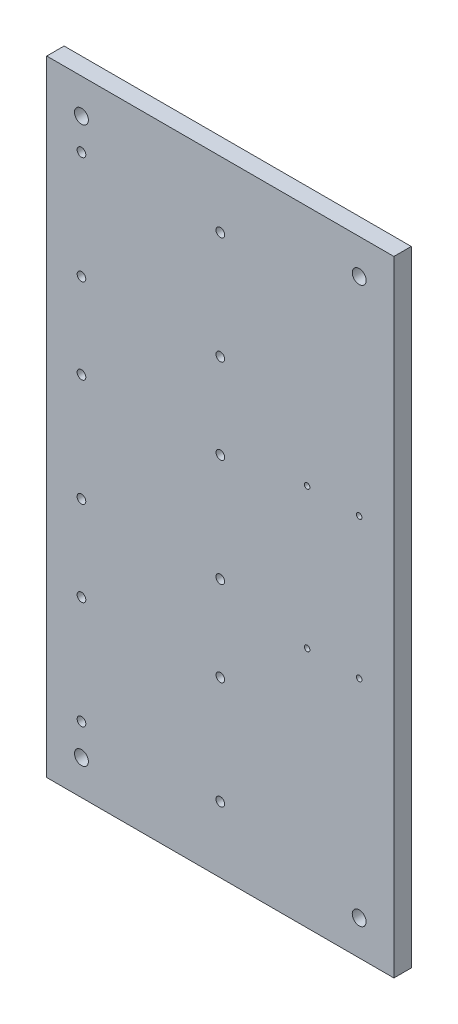
ISO-10303-21;
HEADER;
FILE_DESCRIPTION(('STEP AP214'),'2;1');
FILE_NAME('part.step','',(''),(''),'','','');
FILE_SCHEMA(('AUTOMOTIVE_DESIGN { 1 0 10303 214 1 1 1 1 }'));
ENDSEC;
DATA;
#1=APPLICATION_CONTEXT('core data for automotive mechanical design processes');
#2=APPLICATION_PROTOCOL_DEFINITION('international standard','automotive_design',2000,#1);
#3=PRODUCT_CONTEXT('',#1,'mechanical');
#4=PRODUCT('Part','Part','',(#3));
#5=PRODUCT_RELATED_PRODUCT_CATEGORY('part','',(#4));
#6=PRODUCT_DEFINITION_FORMATION('','',#4);
#7=PRODUCT_DEFINITION_CONTEXT('part definition',#1,'design');
#8=PRODUCT_DEFINITION('design','',#6,#7);
#9=PRODUCT_DEFINITION_SHAPE('','',#8);
#10=(LENGTH_UNIT() NAMED_UNIT(*) SI_UNIT(.MILLI.,.METRE.));
#11=(NAMED_UNIT(*) PLANE_ANGLE_UNIT() SI_UNIT($,.RADIAN.));
#12=(NAMED_UNIT(*) SI_UNIT($,.STERADIAN.) SOLID_ANGLE_UNIT());
#13=UNCERTAINTY_MEASURE_WITH_UNIT(LENGTH_MEASURE(1.E-05),#10,'distance_accuracy_value','');
#14=(GEOMETRIC_REPRESENTATION_CONTEXT(3) GLOBAL_UNCERTAINTY_ASSIGNED_CONTEXT((#13)) GLOBAL_UNIT_ASSIGNED_CONTEXT((#10,
#11,#12)) REPRESENTATION_CONTEXT('',''));
#15=CARTESIAN_POINT('',(0.,0.,0.));
#16=DIRECTION('',(0.,0.,1.));
#17=DIRECTION('',(1.,0.,0.));
#18=AXIS2_PLACEMENT_3D('',#15,#16,#17);
#19=CARTESIAN_POINT('',(0.,0.,5.));
#20=DIRECTION('',(1.,0.,0.));
#21=DIRECTION('',(0.,0.,-1.));
#22=AXIS2_PLACEMENT_3D('',#19,#20,#21);
#23=PLANE('',#22);
#24=DIRECTION('',(0.,-1.,0.));
#25=VECTOR('',#24,1.);
#26=CARTESIAN_POINT('',(0.,0.,0.));
#27=LINE('',#26,#25);
#28=CARTESIAN_POINT('',(0.,180.,0.));
#29=VERTEX_POINT('',#28);
#30=CARTESIAN_POINT('',(0.,0.,0.));
#31=VERTEX_POINT('',#30);
#32=EDGE_CURVE('E95',#29,#31,#27,.T.);
#33=ORIENTED_EDGE('',*,*,#32,.T.);
#34=DIRECTION('',(0.,0.,-1.));
#35=VECTOR('',#34,1.);
#36=CARTESIAN_POINT('',(0.,0.,5.));
#37=LINE('',#36,#35);
#38=CARTESIAN_POINT('',(0.,0.,5.));
#39=VERTEX_POINT('',#38);
#40=EDGE_CURVE('E11',#39,#31,#37,.T.);
#41=ORIENTED_EDGE('',*,*,#40,.F.);
#42=DIRECTION('',(0.,-1.,0.));
#43=VECTOR('',#42,1.);
#44=CARTESIAN_POINT('',(0.,0.,5.));
#45=LINE('',#44,#43);
#46=CARTESIAN_POINT('',(0.,180.,5.));
#47=VERTEX_POINT('',#46);
#48=EDGE_CURVE('E83',#47,#39,#45,.T.);
#49=ORIENTED_EDGE('',*,*,#48,.F.);
#50=DIRECTION('',(0.,0.,-1.));
#51=VECTOR('',#50,1.);
#52=CARTESIAN_POINT('',(0.,180.,5.));
#53=LINE('',#52,#51);
#54=EDGE_CURVE('E91',#47,#29,#53,.T.);
#55=ORIENTED_EDGE('',*,*,#54,.T.);
#56=EDGE_LOOP('',(#33,#41,#49,#55));
#57=FACE_BOUND('',#56,.T.);
#58=ADVANCED_FACE('F32',(#57),#23,.F.);
#59=CARTESIAN_POINT('',(0.,0.,5.));
#60=DIRECTION('',(0.,1.,0.));
#61=DIRECTION('',(0.,0.,1.));
#62=AXIS2_PLACEMENT_3D('',#59,#60,#61);
#63=PLANE('',#62);
#64=DIRECTION('',(1.,0.,0.));
#65=VECTOR('',#64,1.);
#66=CARTESIAN_POINT('',(0.,0.,0.));
#67=LINE('',#66,#65);
#68=CARTESIAN_POINT('',(100.,0.,0.));
#69=VERTEX_POINT('',#68);
#70=EDGE_CURVE('E87',#31,#69,#67,.T.);
#71=ORIENTED_EDGE('',*,*,#70,.T.);
#72=DIRECTION('',(0.,0.,-1.));
#73=VECTOR('',#72,1.);
#74=CARTESIAN_POINT('',(100.,0.,5.));
#75=LINE('',#74,#73);
#76=CARTESIAN_POINT('',(100.,0.,5.));
#77=VERTEX_POINT('',#76);
#78=EDGE_CURVE('E40',#77,#69,#75,.T.);
#79=ORIENTED_EDGE('',*,*,#78,.F.);
#80=DIRECTION('',(1.,0.,0.));
#81=VECTOR('',#80,1.);
#82=CARTESIAN_POINT('',(0.,0.,5.));
#83=LINE('',#82,#81);
#84=EDGE_CURVE('E78',#39,#77,#83,.T.);
#85=ORIENTED_EDGE('',*,*,#84,.F.);
#86=ORIENTED_EDGE('',*,*,#40,.T.);
#87=EDGE_LOOP('',(#71,#79,#85,#86));
#88=FACE_BOUND('',#87,.T.);
#89=ADVANCED_FACE('F86',(#88),#63,.F.);
#90=CARTESIAN_POINT('',(100.,0.,5.));
#91=DIRECTION('',(-1.,0.,0.));
#92=DIRECTION('',(0.,0.,1.));
#93=AXIS2_PLACEMENT_3D('',#90,#91,#92);
#94=PLANE('',#93);
#95=DIRECTION('',(0.,1.,0.));
#96=VECTOR('',#95,1.);
#97=CARTESIAN_POINT('',(100.,0.,0.));
#98=LINE('',#97,#96);
#99=CARTESIAN_POINT('',(100.,180.,0.));
#100=VERTEX_POINT('',#99);
#101=EDGE_CURVE('E65',#69,#100,#98,.T.);
#102=ORIENTED_EDGE('',*,*,#101,.T.);
#103=DIRECTION('',(0.,0.,-1.));
#104=VECTOR('',#103,1.);
#105=CARTESIAN_POINT('',(100.,180.,5.));
#106=LINE('',#105,#104);
#107=CARTESIAN_POINT('',(100.,180.,5.));
#108=VERTEX_POINT('',#107);
#109=EDGE_CURVE('E88',#108,#100,#106,.T.);
#110=ORIENTED_EDGE('',*,*,#109,.F.);
#111=DIRECTION('',(0.,1.,0.));
#112=VECTOR('',#111,1.);
#113=CARTESIAN_POINT('',(100.,0.,5.));
#114=LINE('',#113,#112);
#115=EDGE_CURVE('E81',#77,#108,#114,.T.);
#116=ORIENTED_EDGE('',*,*,#115,.F.);
#117=ORIENTED_EDGE('',*,*,#78,.T.);
#118=EDGE_LOOP('',(#102,#110,#116,#117));
#119=FACE_BOUND('',#118,.T.);
#120=ADVANCED_FACE('F89',(#119),#94,.F.);
#121=CARTESIAN_POINT('',(0.,180.,5.));
#122=DIRECTION('',(0.,-1.,0.));
#123=DIRECTION('',(0.,0.,-1.));
#124=AXIS2_PLACEMENT_3D('',#121,#122,#123);
#125=PLANE('',#124);
#126=DIRECTION('',(-1.,0.,0.));
#127=VECTOR('',#126,1.);
#128=CARTESIAN_POINT('',(0.,180.,0.));
#129=LINE('',#128,#127);
#130=EDGE_CURVE('E71',#100,#29,#129,.T.);
#131=ORIENTED_EDGE('',*,*,#130,.T.);
#132=ORIENTED_EDGE('',*,*,#54,.F.);
#133=DIRECTION('',(-1.,0.,0.));
#134=VECTOR('',#133,1.);
#135=CARTESIAN_POINT('',(0.,180.,5.));
#136=LINE('',#135,#134);
#137=EDGE_CURVE('E48',#108,#47,#136,.T.);
#138=ORIENTED_EDGE('',*,*,#137,.F.);
#139=ORIENTED_EDGE('',*,*,#109,.T.);
#140=EDGE_LOOP('',(#131,#132,#138,#139));
#141=FACE_BOUND('',#140,.T.);
#142=ADVANCED_FACE('F103',(#141),#125,.F.);
#143=CARTESIAN_POINT('',(0.,0.,5.));
#144=DIRECTION('',(0.,0.,-1.));
#145=DIRECTION('',(-1.,0.,0.));
#146=AXIS2_PLACEMENT_3D('',#143,#144,#145);
#147=PLANE('',#146);
#148=CARTESIAN_POINT('',(9.99999999999999,10.,5.));
#149=DIRECTION('',(0.,0.,1.));
#150=DIRECTION('',(1.,0.,0.));
#151=AXIS2_PLACEMENT_3D('',#148,#149,#150);
#152=CIRCLE('',#151,2.);
#153=CARTESIAN_POINT('',(12.,10.,5.));
#154=VERTEX_POINT('',#153);
#155=EDGE_CURVE('E223',#154,#154,#152,.T.);
#156=ORIENTED_EDGE('',*,*,#155,.F.);
#157=EDGE_LOOP('',(#156));
#158=FACE_BOUND('',#157,.T.);
#159=CARTESIAN_POINT('',(9.99999999999999,170.,5.));
#160=DIRECTION('',(0.,0.,1.));
#161=DIRECTION('',(-1.,0.,0.));
#162=AXIS2_PLACEMENT_3D('',#159,#160,#161);
#163=CIRCLE('',#162,2.);
#164=CARTESIAN_POINT('',(8.,170.,5.));
#165=VERTEX_POINT('',#164);
#166=EDGE_CURVE('E217',#165,#165,#163,.T.);
#167=ORIENTED_EDGE('',*,*,#166,.F.);
#168=EDGE_LOOP('',(#167));
#169=FACE_BOUND('',#168,.T.);
#170=CARTESIAN_POINT('',(90.,10.,5.));
#171=DIRECTION('',(0.,0.,1.));
#172=DIRECTION('',(-1.,0.,0.));
#173=AXIS2_PLACEMENT_3D('',#170,#171,#172);
#174=CIRCLE('',#173,2.);
#175=CARTESIAN_POINT('',(88.,10.,5.));
#176=VERTEX_POINT('',#175);
#177=EDGE_CURVE('E211',#176,#176,#174,.T.);
#178=ORIENTED_EDGE('',*,*,#177,.F.);
#179=EDGE_LOOP('',(#178));
#180=FACE_BOUND('',#179,.T.);
#181=CARTESIAN_POINT('',(90.,170.,5.));
#182=DIRECTION('',(0.,0.,1.));
#183=DIRECTION('',(1.,0.,0.));
#184=AXIS2_PLACEMENT_3D('',#181,#182,#183);
#185=CIRCLE('',#184,2.);
#186=CARTESIAN_POINT('',(92.,170.,5.));
#187=VERTEX_POINT('',#186);
#188=EDGE_CURVE('E205',#187,#187,#185,.T.);
#189=ORIENTED_EDGE('',*,*,#188,.F.);
#190=EDGE_LOOP('',(#189));
#191=FACE_BOUND('',#190,.T.);
#192=CARTESIAN_POINT('',(75.,69.75,5.));
#193=DIRECTION('',(0.,0.,1.));
#194=DIRECTION('',(-1.,0.,0.));
#195=AXIS2_PLACEMENT_3D('',#192,#193,#194);
#196=CIRCLE('',#195,0.799999999999994);
#197=CARTESIAN_POINT('',(74.2,69.75,5.));
#198=VERTEX_POINT('',#197);
#199=EDGE_CURVE('E199',#198,#198,#196,.T.);
#200=ORIENTED_EDGE('',*,*,#199,.F.);
#201=EDGE_LOOP('',(#200));
#202=FACE_BOUND('',#201,.T.);
#203=CARTESIAN_POINT('',(90.,69.75,5.));
#204=DIRECTION('',(0.,0.,1.));
#205=DIRECTION('',(-1.,0.,0.));
#206=AXIS2_PLACEMENT_3D('',#203,#204,#205);
#207=CIRCLE('',#206,0.799999999999994);
#208=CARTESIAN_POINT('',(89.2,69.75,5.));
#209=VERTEX_POINT('',#208);
#210=EDGE_CURVE('E193',#209,#209,#207,.T.);
#211=ORIENTED_EDGE('',*,*,#210,.F.);
#212=EDGE_LOOP('',(#211));
#213=FACE_BOUND('',#212,.T.);
#214=CARTESIAN_POINT('',(90.,110.25,5.));
#215=DIRECTION('',(0.,0.,1.));
#216=DIRECTION('',(1.,0.,0.));
#217=AXIS2_PLACEMENT_3D('',#214,#215,#216);
#218=CIRCLE('',#217,0.799999999999994);
#219=CARTESIAN_POINT('',(90.8,110.25,5.));
#220=VERTEX_POINT('',#219);
#221=EDGE_CURVE('E187',#220,#220,#218,.T.);
#222=ORIENTED_EDGE('',*,*,#221,.F.);
#223=EDGE_LOOP('',(#222));
#224=FACE_BOUND('',#223,.T.);
#225=CARTESIAN_POINT('',(75.,110.25,5.));
#226=DIRECTION('',(0.,0.,1.));
#227=DIRECTION('',(1.,0.,0.));
#228=AXIS2_PLACEMENT_3D('',#225,#226,#227);
#229=CIRCLE('',#228,0.799999999999994);
#230=CARTESIAN_POINT('',(75.8,110.25,5.));
#231=VERTEX_POINT('',#230);
#232=EDGE_CURVE('E181',#231,#231,#229,.T.);
#233=ORIENTED_EDGE('',*,*,#232,.F.);
#234=EDGE_LOOP('',(#233));
#235=FACE_BOUND('',#234,.T.);
#236=CARTESIAN_POINT('',(10.,50.,5.));
#237=DIRECTION('',(0.,0.,1.));
#238=DIRECTION('',(-1.,0.,0.));
#239=AXIS2_PLACEMENT_3D('',#236,#237,#238);
#240=CIRCLE('',#239,1.25);
#241=CARTESIAN_POINT('',(8.75000000000002,50.,5.));
#242=VERTEX_POINT('',#241);
#243=EDGE_CURVE('E175',#242,#242,#240,.T.);
#244=ORIENTED_EDGE('',*,*,#243,.F.);
#245=EDGE_LOOP('',(#244));
#246=FACE_BOUND('',#245,.T.);
#247=CARTESIAN_POINT('',(50.,50.,5.));
#248=DIRECTION('',(0.,0.,1.));
#249=DIRECTION('',(-1.,0.,0.));
#250=AXIS2_PLACEMENT_3D('',#247,#248,#249);
#251=CIRCLE('',#250,1.25);
#252=CARTESIAN_POINT('',(48.75,50.,5.));
#253=VERTEX_POINT('',#252);
#254=EDGE_CURVE('E169',#253,#253,#251,.T.);
#255=ORIENTED_EDGE('',*,*,#254,.F.);
#256=EDGE_LOOP('',(#255));
#257=FACE_BOUND('',#256,.T.);
#258=CARTESIAN_POINT('',(50.,19.,5.));
#259=DIRECTION('',(0.,0.,1.));
#260=DIRECTION('',(-1.,0.,0.));
#261=AXIS2_PLACEMENT_3D('',#258,#259,#260);
#262=CIRCLE('',#261,1.25);
#263=CARTESIAN_POINT('',(48.75,19.,5.));
#264=VERTEX_POINT('',#263);
#265=EDGE_CURVE('E163',#264,#264,#262,.T.);
#266=ORIENTED_EDGE('',*,*,#265,.F.);
#267=EDGE_LOOP('',(#266));
#268=FACE_BOUND('',#267,.T.);
#269=CARTESIAN_POINT('',(10.,19.,5.));
#270=DIRECTION('',(0.,0.,1.));
#271=DIRECTION('',(-1.,0.,0.));
#272=AXIS2_PLACEMENT_3D('',#269,#270,#271);
#273=CIRCLE('',#272,1.25);
#274=CARTESIAN_POINT('',(8.75000000000003,19.,5.));
#275=VERTEX_POINT('',#274);
#276=EDGE_CURVE('E157',#275,#275,#273,.T.);
#277=ORIENTED_EDGE('',*,*,#276,.F.);
#278=EDGE_LOOP('',(#277));
#279=FACE_BOUND('',#278,.T.);
#280=CARTESIAN_POINT('',(10.,161.,5.));
#281=DIRECTION('',(0.,0.,1.));
#282=DIRECTION('',(1.,0.,0.));
#283=AXIS2_PLACEMENT_3D('',#280,#281,#282);
#284=CIRCLE('',#283,1.25);
#285=CARTESIAN_POINT('',(11.25,161.,5.));
#286=VERTEX_POINT('',#285);
#287=EDGE_CURVE('E151',#286,#286,#284,.T.);
#288=ORIENTED_EDGE('',*,*,#287,.F.);
#289=EDGE_LOOP('',(#288));
#290=FACE_BOUND('',#289,.T.);
#291=CARTESIAN_POINT('',(50.,161.,5.));
#292=DIRECTION('',(0.,0.,1.));
#293=DIRECTION('',(1.,0.,0.));
#294=AXIS2_PLACEMENT_3D('',#291,#292,#293);
#295=CIRCLE('',#294,1.25);
#296=CARTESIAN_POINT('',(51.25,161.,5.));
#297=VERTEX_POINT('',#296);
#298=EDGE_CURVE('E145',#297,#297,#295,.T.);
#299=ORIENTED_EDGE('',*,*,#298,.F.);
#300=EDGE_LOOP('',(#299));
#301=FACE_BOUND('',#300,.T.);
#302=CARTESIAN_POINT('',(50.,130.,5.));
#303=DIRECTION('',(0.,0.,1.));
#304=DIRECTION('',(1.,0.,0.));
#305=AXIS2_PLACEMENT_3D('',#302,#303,#304);
#306=CIRCLE('',#305,1.25);
#307=CARTESIAN_POINT('',(51.25,130.,5.));
#308=VERTEX_POINT('',#307);
#309=EDGE_CURVE('E139',#308,#308,#306,.T.);
#310=ORIENTED_EDGE('',*,*,#309,.F.);
#311=EDGE_LOOP('',(#310));
#312=FACE_BOUND('',#311,.T.);
#313=CARTESIAN_POINT('',(10.,130.,5.));
#314=DIRECTION('',(0.,0.,1.));
#315=DIRECTION('',(1.,0.,0.));
#316=AXIS2_PLACEMENT_3D('',#313,#314,#315);
#317=CIRCLE('',#316,1.25);
#318=CARTESIAN_POINT('',(11.25,130.,5.));
#319=VERTEX_POINT('',#318);
#320=EDGE_CURVE('E133',#319,#319,#317,.T.);
#321=ORIENTED_EDGE('',*,*,#320,.F.);
#322=EDGE_LOOP('',(#321));
#323=FACE_BOUND('',#322,.T.);
#324=CARTESIAN_POINT('',(10.,74.5,5.));
#325=DIRECTION('',(0.,0.,1.));
#326=DIRECTION('',(-1.,0.,0.));
#327=AXIS2_PLACEMENT_3D('',#324,#325,#326);
#328=CIRCLE('',#327,1.25);
#329=CARTESIAN_POINT('',(8.75000000000001,74.5,5.));
#330=VERTEX_POINT('',#329);
#331=EDGE_CURVE('E127',#330,#330,#328,.T.);
#332=ORIENTED_EDGE('',*,*,#331,.F.);
#333=EDGE_LOOP('',(#332));
#334=FACE_BOUND('',#333,.T.);
#335=CARTESIAN_POINT('',(50.,74.5,5.));
#336=DIRECTION('',(0.,0.,1.));
#337=DIRECTION('',(-1.,0.,0.));
#338=AXIS2_PLACEMENT_3D('',#335,#336,#337);
#339=CIRCLE('',#338,1.25);
#340=CARTESIAN_POINT('',(48.75,74.5,5.));
#341=VERTEX_POINT('',#340);
#342=EDGE_CURVE('E121',#341,#341,#339,.T.);
#343=ORIENTED_EDGE('',*,*,#342,.F.);
#344=EDGE_LOOP('',(#343));
#345=FACE_BOUND('',#344,.T.);
#346=CARTESIAN_POINT('',(50.,105.5,5.));
#347=DIRECTION('',(0.,0.,1.));
#348=DIRECTION('',(1.,0.,0.));
#349=AXIS2_PLACEMENT_3D('',#346,#347,#348);
#350=CIRCLE('',#349,1.25);
#351=CARTESIAN_POINT('',(51.25,105.5,5.));
#352=VERTEX_POINT('',#351);
#353=EDGE_CURVE('E115',#352,#352,#350,.T.);
#354=ORIENTED_EDGE('',*,*,#353,.F.);
#355=EDGE_LOOP('',(#354));
#356=FACE_BOUND('',#355,.T.);
#357=CARTESIAN_POINT('',(10.,105.5,5.));
#358=DIRECTION('',(0.,0.,1.));
#359=DIRECTION('',(1.,0.,0.));
#360=AXIS2_PLACEMENT_3D('',#357,#358,#359);
#361=CIRCLE('',#360,1.25);
#362=CARTESIAN_POINT('',(11.25,105.5,5.));
#363=VERTEX_POINT('',#362);
#364=EDGE_CURVE('E109',#363,#363,#361,.T.);
#365=ORIENTED_EDGE('',*,*,#364,.F.);
#366=EDGE_LOOP('',(#365));
#367=FACE_BOUND('',#366,.T.);
#368=ORIENTED_EDGE('',*,*,#48,.T.);
#369=ORIENTED_EDGE('',*,*,#84,.T.);
#370=ORIENTED_EDGE('',*,*,#115,.T.);
#371=ORIENTED_EDGE('',*,*,#137,.T.);
#372=EDGE_LOOP('',(#368,#369,#370,#371));
#373=FACE_BOUND('',#372,.T.);
#374=ADVANCED_FACE('F79',(#158,#169,#180,#191,#202,#213,#224,#235,#246,#257,#268,#279,#290,#301,
#312,#323,#334,#345,#356,#367,#373),#147,.F.);
#375=CARTESIAN_POINT('',(0.,0.,0.));
#376=DIRECTION('',(0.,0.,-1.));
#377=DIRECTION('',(-1.,0.,0.));
#378=AXIS2_PLACEMENT_3D('',#375,#376,#377);
#379=PLANE('',#378);
#380=CARTESIAN_POINT('',(9.99999999999999,10.,0.));
#381=DIRECTION('',(0.,0.,1.));
#382=DIRECTION('',(1.,0.,0.));
#383=AXIS2_PLACEMENT_3D('',#380,#381,#382);
#384=CIRCLE('',#383,2.);
#385=CARTESIAN_POINT('',(12.,10.,0.));
#386=VERTEX_POINT('',#385);
#387=EDGE_CURVE('E220',#386,#386,#384,.T.);
#388=ORIENTED_EDGE('',*,*,#387,.T.);
#389=EDGE_LOOP('',(#388));
#390=FACE_BOUND('',#389,.T.);
#391=CARTESIAN_POINT('',(9.99999999999999,170.,0.));
#392=DIRECTION('',(0.,0.,1.));
#393=DIRECTION('',(-1.,0.,0.));
#394=AXIS2_PLACEMENT_3D('',#391,#392,#393);
#395=CIRCLE('',#394,2.);
#396=CARTESIAN_POINT('',(8.,170.,0.));
#397=VERTEX_POINT('',#396);
#398=EDGE_CURVE('E214',#397,#397,#395,.T.);
#399=ORIENTED_EDGE('',*,*,#398,.T.);
#400=EDGE_LOOP('',(#399));
#401=FACE_BOUND('',#400,.T.);
#402=CARTESIAN_POINT('',(90.,10.,0.));
#403=DIRECTION('',(0.,0.,1.));
#404=DIRECTION('',(-1.,0.,0.));
#405=AXIS2_PLACEMENT_3D('',#402,#403,#404);
#406=CIRCLE('',#405,2.);
#407=CARTESIAN_POINT('',(88.,10.,0.));
#408=VERTEX_POINT('',#407);
#409=EDGE_CURVE('E208',#408,#408,#406,.T.);
#410=ORIENTED_EDGE('',*,*,#409,.T.);
#411=EDGE_LOOP('',(#410));
#412=FACE_BOUND('',#411,.T.);
#413=CARTESIAN_POINT('',(90.,170.,0.));
#414=DIRECTION('',(0.,0.,1.));
#415=DIRECTION('',(1.,0.,0.));
#416=AXIS2_PLACEMENT_3D('',#413,#414,#415);
#417=CIRCLE('',#416,2.);
#418=CARTESIAN_POINT('',(92.,170.,0.));
#419=VERTEX_POINT('',#418);
#420=EDGE_CURVE('E202',#419,#419,#417,.T.);
#421=ORIENTED_EDGE('',*,*,#420,.T.);
#422=EDGE_LOOP('',(#421));
#423=FACE_BOUND('',#422,.T.);
#424=CARTESIAN_POINT('',(75.,69.75,0.));
#425=DIRECTION('',(0.,0.,1.));
#426=DIRECTION('',(-1.,0.,0.));
#427=AXIS2_PLACEMENT_3D('',#424,#425,#426);
#428=CIRCLE('',#427,0.799999999999994);
#429=CARTESIAN_POINT('',(74.2,69.75,0.));
#430=VERTEX_POINT('',#429);
#431=EDGE_CURVE('E196',#430,#430,#428,.T.);
#432=ORIENTED_EDGE('',*,*,#431,.T.);
#433=EDGE_LOOP('',(#432));
#434=FACE_BOUND('',#433,.T.);
#435=CARTESIAN_POINT('',(90.,69.75,0.));
#436=DIRECTION('',(0.,0.,1.));
#437=DIRECTION('',(-1.,0.,0.));
#438=AXIS2_PLACEMENT_3D('',#435,#436,#437);
#439=CIRCLE('',#438,0.799999999999994);
#440=CARTESIAN_POINT('',(89.2,69.75,0.));
#441=VERTEX_POINT('',#440);
#442=EDGE_CURVE('E190',#441,#441,#439,.T.);
#443=ORIENTED_EDGE('',*,*,#442,.T.);
#444=EDGE_LOOP('',(#443));
#445=FACE_BOUND('',#444,.T.);
#446=CARTESIAN_POINT('',(90.,110.25,0.));
#447=DIRECTION('',(0.,0.,1.));
#448=DIRECTION('',(1.,0.,0.));
#449=AXIS2_PLACEMENT_3D('',#446,#447,#448);
#450=CIRCLE('',#449,0.799999999999994);
#451=CARTESIAN_POINT('',(90.8,110.25,0.));
#452=VERTEX_POINT('',#451);
#453=EDGE_CURVE('E184',#452,#452,#450,.T.);
#454=ORIENTED_EDGE('',*,*,#453,.T.);
#455=EDGE_LOOP('',(#454));
#456=FACE_BOUND('',#455,.T.);
#457=CARTESIAN_POINT('',(75.,110.25,0.));
#458=DIRECTION('',(0.,0.,1.));
#459=DIRECTION('',(1.,0.,0.));
#460=AXIS2_PLACEMENT_3D('',#457,#458,#459);
#461=CIRCLE('',#460,0.799999999999994);
#462=CARTESIAN_POINT('',(75.8,110.25,0.));
#463=VERTEX_POINT('',#462);
#464=EDGE_CURVE('E178',#463,#463,#461,.T.);
#465=ORIENTED_EDGE('',*,*,#464,.T.);
#466=EDGE_LOOP('',(#465));
#467=FACE_BOUND('',#466,.T.);
#468=CARTESIAN_POINT('',(10.,50.,0.));
#469=DIRECTION('',(0.,0.,1.));
#470=DIRECTION('',(-1.,0.,0.));
#471=AXIS2_PLACEMENT_3D('',#468,#469,#470);
#472=CIRCLE('',#471,1.25);
#473=CARTESIAN_POINT('',(8.75000000000002,50.,0.));
#474=VERTEX_POINT('',#473);
#475=EDGE_CURVE('E172',#474,#474,#472,.T.);
#476=ORIENTED_EDGE('',*,*,#475,.T.);
#477=EDGE_LOOP('',(#476));
#478=FACE_BOUND('',#477,.T.);
#479=CARTESIAN_POINT('',(50.,50.,0.));
#480=DIRECTION('',(0.,0.,1.));
#481=DIRECTION('',(-1.,0.,0.));
#482=AXIS2_PLACEMENT_3D('',#479,#480,#481);
#483=CIRCLE('',#482,1.25);
#484=CARTESIAN_POINT('',(48.75,50.,0.));
#485=VERTEX_POINT('',#484);
#486=EDGE_CURVE('E166',#485,#485,#483,.T.);
#487=ORIENTED_EDGE('',*,*,#486,.T.);
#488=EDGE_LOOP('',(#487));
#489=FACE_BOUND('',#488,.T.);
#490=CARTESIAN_POINT('',(50.,19.,0.));
#491=DIRECTION('',(0.,0.,1.));
#492=DIRECTION('',(-1.,0.,0.));
#493=AXIS2_PLACEMENT_3D('',#490,#491,#492);
#494=CIRCLE('',#493,1.25);
#495=CARTESIAN_POINT('',(48.75,19.,0.));
#496=VERTEX_POINT('',#495);
#497=EDGE_CURVE('E160',#496,#496,#494,.T.);
#498=ORIENTED_EDGE('',*,*,#497,.T.);
#499=EDGE_LOOP('',(#498));
#500=FACE_BOUND('',#499,.T.);
#501=CARTESIAN_POINT('',(10.,19.,0.));
#502=DIRECTION('',(0.,0.,1.));
#503=DIRECTION('',(-1.,0.,0.));
#504=AXIS2_PLACEMENT_3D('',#501,#502,#503);
#505=CIRCLE('',#504,1.25);
#506=CARTESIAN_POINT('',(8.75000000000003,19.,0.));
#507=VERTEX_POINT('',#506);
#508=EDGE_CURVE('E154',#507,#507,#505,.T.);
#509=ORIENTED_EDGE('',*,*,#508,.T.);
#510=EDGE_LOOP('',(#509));
#511=FACE_BOUND('',#510,.T.);
#512=CARTESIAN_POINT('',(10.,161.,0.));
#513=DIRECTION('',(0.,0.,1.));
#514=DIRECTION('',(1.,0.,0.));
#515=AXIS2_PLACEMENT_3D('',#512,#513,#514);
#516=CIRCLE('',#515,1.25);
#517=CARTESIAN_POINT('',(11.25,161.,0.));
#518=VERTEX_POINT('',#517);
#519=EDGE_CURVE('E148',#518,#518,#516,.T.);
#520=ORIENTED_EDGE('',*,*,#519,.T.);
#521=EDGE_LOOP('',(#520));
#522=FACE_BOUND('',#521,.T.);
#523=CARTESIAN_POINT('',(50.,161.,0.));
#524=DIRECTION('',(0.,0.,1.));
#525=DIRECTION('',(1.,0.,0.));
#526=AXIS2_PLACEMENT_3D('',#523,#524,#525);
#527=CIRCLE('',#526,1.25);
#528=CARTESIAN_POINT('',(51.25,161.,0.));
#529=VERTEX_POINT('',#528);
#530=EDGE_CURVE('E142',#529,#529,#527,.T.);
#531=ORIENTED_EDGE('',*,*,#530,.T.);
#532=EDGE_LOOP('',(#531));
#533=FACE_BOUND('',#532,.T.);
#534=CARTESIAN_POINT('',(50.,130.,0.));
#535=DIRECTION('',(0.,0.,1.));
#536=DIRECTION('',(1.,0.,0.));
#537=AXIS2_PLACEMENT_3D('',#534,#535,#536);
#538=CIRCLE('',#537,1.25);
#539=CARTESIAN_POINT('',(51.25,130.,0.));
#540=VERTEX_POINT('',#539);
#541=EDGE_CURVE('E136',#540,#540,#538,.T.);
#542=ORIENTED_EDGE('',*,*,#541,.T.);
#543=EDGE_LOOP('',(#542));
#544=FACE_BOUND('',#543,.T.);
#545=CARTESIAN_POINT('',(10.,130.,0.));
#546=DIRECTION('',(0.,0.,1.));
#547=DIRECTION('',(1.,0.,0.));
#548=AXIS2_PLACEMENT_3D('',#545,#546,#547);
#549=CIRCLE('',#548,1.25);
#550=CARTESIAN_POINT('',(11.25,130.,0.));
#551=VERTEX_POINT('',#550);
#552=EDGE_CURVE('E130',#551,#551,#549,.T.);
#553=ORIENTED_EDGE('',*,*,#552,.T.);
#554=EDGE_LOOP('',(#553));
#555=FACE_BOUND('',#554,.T.);
#556=CARTESIAN_POINT('',(10.,74.5,0.));
#557=DIRECTION('',(0.,0.,1.));
#558=DIRECTION('',(-1.,0.,0.));
#559=AXIS2_PLACEMENT_3D('',#556,#557,#558);
#560=CIRCLE('',#559,1.25);
#561=CARTESIAN_POINT('',(8.75000000000001,74.5,0.));
#562=VERTEX_POINT('',#561);
#563=EDGE_CURVE('E124',#562,#562,#560,.T.);
#564=ORIENTED_EDGE('',*,*,#563,.T.);
#565=EDGE_LOOP('',(#564));
#566=FACE_BOUND('',#565,.T.);
#567=CARTESIAN_POINT('',(50.,74.5,0.));
#568=DIRECTION('',(0.,0.,1.));
#569=DIRECTION('',(-1.,0.,0.));
#570=AXIS2_PLACEMENT_3D('',#567,#568,#569);
#571=CIRCLE('',#570,1.25);
#572=CARTESIAN_POINT('',(48.75,74.5,0.));
#573=VERTEX_POINT('',#572);
#574=EDGE_CURVE('E118',#573,#573,#571,.T.);
#575=ORIENTED_EDGE('',*,*,#574,.T.);
#576=EDGE_LOOP('',(#575));
#577=FACE_BOUND('',#576,.T.);
#578=CARTESIAN_POINT('',(50.,105.5,0.));
#579=DIRECTION('',(0.,0.,1.));
#580=DIRECTION('',(1.,0.,0.));
#581=AXIS2_PLACEMENT_3D('',#578,#579,#580);
#582=CIRCLE('',#581,1.25);
#583=CARTESIAN_POINT('',(51.25,105.5,0.));
#584=VERTEX_POINT('',#583);
#585=EDGE_CURVE('E112',#584,#584,#582,.T.);
#586=ORIENTED_EDGE('',*,*,#585,.T.);
#587=EDGE_LOOP('',(#586));
#588=FACE_BOUND('',#587,.T.);
#589=CARTESIAN_POINT('',(10.,105.5,0.));
#590=DIRECTION('',(0.,0.,1.));
#591=DIRECTION('',(1.,0.,0.));
#592=AXIS2_PLACEMENT_3D('',#589,#590,#591);
#593=CIRCLE('',#592,1.25);
#594=CARTESIAN_POINT('',(11.25,105.5,0.));
#595=VERTEX_POINT('',#594);
#596=EDGE_CURVE('E98',#595,#595,#593,.T.);
#597=ORIENTED_EDGE('',*,*,#596,.T.);
#598=EDGE_LOOP('',(#597));
#599=FACE_BOUND('',#598,.T.);
#600=ORIENTED_EDGE('',*,*,#32,.F.);
#601=ORIENTED_EDGE('',*,*,#130,.F.);
#602=ORIENTED_EDGE('',*,*,#101,.F.);
#603=ORIENTED_EDGE('',*,*,#70,.F.);
#604=EDGE_LOOP('',(#600,#601,#602,#603));
#605=FACE_BOUND('',#604,.T.);
#606=ADVANCED_FACE('F106',(#390,#401,#412,#423,#434,#445,#456,#467,#478,#489,#500,#511,#522,
#533,#544,#555,#566,#577,#588,#599,#605),#379,.T.);
#607=CARTESIAN_POINT('',(10.,105.5,0.));
#608=DIRECTION('',(0.,0.,1.));
#609=DIRECTION('',(1.,0.,0.));
#610=AXIS2_PLACEMENT_3D('',#607,#608,#609);
#611=CYLINDRICAL_SURFACE('',#610,1.25);
#612=ORIENTED_EDGE('',*,*,#596,.F.);
#613=EDGE_LOOP('',(#612));
#614=FACE_BOUND('',#613,.T.);
#615=ORIENTED_EDGE('',*,*,#364,.T.);
#616=EDGE_LOOP('',(#615));
#617=FACE_BOUND('',#616,.T.);
#618=ADVANCED_FACE('F279',(#614,#617),#611,.F.);
#619=CARTESIAN_POINT('',(50.,105.5,0.));
#620=DIRECTION('',(0.,0.,1.));
#621=DIRECTION('',(1.,0.,0.));
#622=AXIS2_PLACEMENT_3D('',#619,#620,#621);
#623=CYLINDRICAL_SURFACE('',#622,1.25);
#624=ORIENTED_EDGE('',*,*,#585,.F.);
#625=EDGE_LOOP('',(#624));
#626=FACE_BOUND('',#625,.T.);
#627=ORIENTED_EDGE('',*,*,#353,.T.);
#628=EDGE_LOOP('',(#627));
#629=FACE_BOUND('',#628,.T.);
#630=ADVANCED_FACE('F281',(#626,#629),#623,.F.);
#631=CARTESIAN_POINT('',(50.,74.5,0.));
#632=DIRECTION('',(0.,0.,1.));
#633=DIRECTION('',(1.,0.,0.));
#634=AXIS2_PLACEMENT_3D('',#631,#632,#633);
#635=CYLINDRICAL_SURFACE('',#634,1.25);
#636=ORIENTED_EDGE('',*,*,#574,.F.);
#637=EDGE_LOOP('',(#636));
#638=FACE_BOUND('',#637,.T.);
#639=ORIENTED_EDGE('',*,*,#342,.T.);
#640=EDGE_LOOP('',(#639));
#641=FACE_BOUND('',#640,.T.);
#642=ADVANCED_FACE('F288',(#638,#641),#635,.F.);
#643=CARTESIAN_POINT('',(10.,74.5,0.));
#644=DIRECTION('',(0.,0.,1.));
#645=DIRECTION('',(1.,0.,0.));
#646=AXIS2_PLACEMENT_3D('',#643,#644,#645);
#647=CYLINDRICAL_SURFACE('',#646,1.25);
#648=ORIENTED_EDGE('',*,*,#563,.F.);
#649=EDGE_LOOP('',(#648));
#650=FACE_BOUND('',#649,.T.);
#651=ORIENTED_EDGE('',*,*,#331,.T.);
#652=EDGE_LOOP('',(#651));
#653=FACE_BOUND('',#652,.T.);
#654=ADVANCED_FACE('F334',(#650,#653),#647,.F.);
#655=CARTESIAN_POINT('',(10.,130.,0.));
#656=DIRECTION('',(0.,0.,1.));
#657=DIRECTION('',(1.,0.,0.));
#658=AXIS2_PLACEMENT_3D('',#655,#656,#657);
#659=CYLINDRICAL_SURFACE('',#658,1.25);
#660=ORIENTED_EDGE('',*,*,#552,.F.);
#661=EDGE_LOOP('',(#660));
#662=FACE_BOUND('',#661,.T.);
#663=ORIENTED_EDGE('',*,*,#320,.T.);
#664=EDGE_LOOP('',(#663));
#665=FACE_BOUND('',#664,.T.);
#666=ADVANCED_FACE('F344',(#662,#665),#659,.F.);
#667=CARTESIAN_POINT('',(50.,130.,0.));
#668=DIRECTION('',(0.,0.,1.));
#669=DIRECTION('',(1.,0.,0.));
#670=AXIS2_PLACEMENT_3D('',#667,#668,#669);
#671=CYLINDRICAL_SURFACE('',#670,1.25);
#672=ORIENTED_EDGE('',*,*,#541,.F.);
#673=EDGE_LOOP('',(#672));
#674=FACE_BOUND('',#673,.T.);
#675=ORIENTED_EDGE('',*,*,#309,.T.);
#676=EDGE_LOOP('',(#675));
#677=FACE_BOUND('',#676,.T.);
#678=ADVANCED_FACE('F354',(#674,#677),#671,.F.);
#679=CARTESIAN_POINT('',(50.,161.,0.));
#680=DIRECTION('',(0.,0.,1.));
#681=DIRECTION('',(1.,0.,0.));
#682=AXIS2_PLACEMENT_3D('',#679,#680,#681);
#683=CYLINDRICAL_SURFACE('',#682,1.25);
#684=ORIENTED_EDGE('',*,*,#530,.F.);
#685=EDGE_LOOP('',(#684));
#686=FACE_BOUND('',#685,.T.);
#687=ORIENTED_EDGE('',*,*,#298,.T.);
#688=EDGE_LOOP('',(#687));
#689=FACE_BOUND('',#688,.T.);
#690=ADVANCED_FACE('F364',(#686,#689),#683,.F.);
#691=CARTESIAN_POINT('',(10.,161.,0.));
#692=DIRECTION('',(0.,0.,1.));
#693=DIRECTION('',(1.,0.,0.));
#694=AXIS2_PLACEMENT_3D('',#691,#692,#693);
#695=CYLINDRICAL_SURFACE('',#694,1.25);
#696=ORIENTED_EDGE('',*,*,#519,.F.);
#697=EDGE_LOOP('',(#696));
#698=FACE_BOUND('',#697,.T.);
#699=ORIENTED_EDGE('',*,*,#287,.T.);
#700=EDGE_LOOP('',(#699));
#701=FACE_BOUND('',#700,.T.);
#702=ADVANCED_FACE('F374',(#698,#701),#695,.F.);
#703=CARTESIAN_POINT('',(10.,19.,0.));
#704=DIRECTION('',(0.,0.,1.));
#705=DIRECTION('',(1.,0.,0.));
#706=AXIS2_PLACEMENT_3D('',#703,#704,#705);
#707=CYLINDRICAL_SURFACE('',#706,1.25);
#708=ORIENTED_EDGE('',*,*,#508,.F.);
#709=EDGE_LOOP('',(#708));
#710=FACE_BOUND('',#709,.T.);
#711=ORIENTED_EDGE('',*,*,#276,.T.);
#712=EDGE_LOOP('',(#711));
#713=FACE_BOUND('',#712,.T.);
#714=ADVANCED_FACE('F384',(#710,#713),#707,.F.);
#715=CARTESIAN_POINT('',(50.,19.,0.));
#716=DIRECTION('',(0.,0.,1.));
#717=DIRECTION('',(1.,0.,0.));
#718=AXIS2_PLACEMENT_3D('',#715,#716,#717);
#719=CYLINDRICAL_SURFACE('',#718,1.25);
#720=ORIENTED_EDGE('',*,*,#497,.F.);
#721=EDGE_LOOP('',(#720));
#722=FACE_BOUND('',#721,.T.);
#723=ORIENTED_EDGE('',*,*,#265,.T.);
#724=EDGE_LOOP('',(#723));
#725=FACE_BOUND('',#724,.T.);
#726=ADVANCED_FACE('F394',(#722,#725),#719,.F.);
#727=CARTESIAN_POINT('',(50.,50.,0.));
#728=DIRECTION('',(0.,0.,1.));
#729=DIRECTION('',(1.,0.,0.));
#730=AXIS2_PLACEMENT_3D('',#727,#728,#729);
#731=CYLINDRICAL_SURFACE('',#730,1.25);
#732=ORIENTED_EDGE('',*,*,#486,.F.);
#733=EDGE_LOOP('',(#732));
#734=FACE_BOUND('',#733,.T.);
#735=ORIENTED_EDGE('',*,*,#254,.T.);
#736=EDGE_LOOP('',(#735));
#737=FACE_BOUND('',#736,.T.);
#738=ADVANCED_FACE('F404',(#734,#737),#731,.F.);
#739=CARTESIAN_POINT('',(10.,50.,0.));
#740=DIRECTION('',(0.,0.,1.));
#741=DIRECTION('',(1.,0.,0.));
#742=AXIS2_PLACEMENT_3D('',#739,#740,#741);
#743=CYLINDRICAL_SURFACE('',#742,1.25);
#744=ORIENTED_EDGE('',*,*,#475,.F.);
#745=EDGE_LOOP('',(#744));
#746=FACE_BOUND('',#745,.T.);
#747=ORIENTED_EDGE('',*,*,#243,.T.);
#748=EDGE_LOOP('',(#747));
#749=FACE_BOUND('',#748,.T.);
#750=ADVANCED_FACE('F414',(#746,#749),#743,.F.);
#751=CARTESIAN_POINT('',(75.,110.25,0.));
#752=DIRECTION('',(0.,0.,1.));
#753=DIRECTION('',(1.,0.,0.));
#754=AXIS2_PLACEMENT_3D('',#751,#752,#753);
#755=CYLINDRICAL_SURFACE('',#754,0.799999999999994);
#756=ORIENTED_EDGE('',*,*,#464,.F.);
#757=EDGE_LOOP('',(#756));
#758=FACE_BOUND('',#757,.T.);
#759=ORIENTED_EDGE('',*,*,#232,.T.);
#760=EDGE_LOOP('',(#759));
#761=FACE_BOUND('',#760,.T.);
#762=ADVANCED_FACE('F424',(#758,#761),#755,.F.);
#763=CARTESIAN_POINT('',(90.,110.25,0.));
#764=DIRECTION('',(0.,0.,1.));
#765=DIRECTION('',(1.,0.,0.));
#766=AXIS2_PLACEMENT_3D('',#763,#764,#765);
#767=CYLINDRICAL_SURFACE('',#766,0.799999999999994);
#768=ORIENTED_EDGE('',*,*,#453,.F.);
#769=EDGE_LOOP('',(#768));
#770=FACE_BOUND('',#769,.T.);
#771=ORIENTED_EDGE('',*,*,#221,.T.);
#772=EDGE_LOOP('',(#771));
#773=FACE_BOUND('',#772,.T.);
#774=ADVANCED_FACE('F434',(#770,#773),#767,.F.);
#775=CARTESIAN_POINT('',(90.,69.75,0.));
#776=DIRECTION('',(0.,0.,1.));
#777=DIRECTION('',(1.,0.,0.));
#778=AXIS2_PLACEMENT_3D('',#775,#776,#777);
#779=CYLINDRICAL_SURFACE('',#778,0.799999999999994);
#780=ORIENTED_EDGE('',*,*,#442,.F.);
#781=EDGE_LOOP('',(#780));
#782=FACE_BOUND('',#781,.T.);
#783=ORIENTED_EDGE('',*,*,#210,.T.);
#784=EDGE_LOOP('',(#783));
#785=FACE_BOUND('',#784,.T.);
#786=ADVANCED_FACE('F444',(#782,#785),#779,.F.);
#787=CARTESIAN_POINT('',(75.,69.75,0.));
#788=DIRECTION('',(0.,0.,1.));
#789=DIRECTION('',(1.,0.,0.));
#790=AXIS2_PLACEMENT_3D('',#787,#788,#789);
#791=CYLINDRICAL_SURFACE('',#790,0.799999999999994);
#792=ORIENTED_EDGE('',*,*,#431,.F.);
#793=EDGE_LOOP('',(#792));
#794=FACE_BOUND('',#793,.T.);
#795=ORIENTED_EDGE('',*,*,#199,.T.);
#796=EDGE_LOOP('',(#795));
#797=FACE_BOUND('',#796,.T.);
#798=ADVANCED_FACE('F454',(#794,#797),#791,.F.);
#799=CARTESIAN_POINT('',(90.,170.,0.));
#800=DIRECTION('',(0.,0.,1.));
#801=DIRECTION('',(1.,0.,0.));
#802=AXIS2_PLACEMENT_3D('',#799,#800,#801);
#803=CYLINDRICAL_SURFACE('',#802,2.);
#804=ORIENTED_EDGE('',*,*,#420,.F.);
#805=EDGE_LOOP('',(#804));
#806=FACE_BOUND('',#805,.T.);
#807=ORIENTED_EDGE('',*,*,#188,.T.);
#808=EDGE_LOOP('',(#807));
#809=FACE_BOUND('',#808,.T.);
#810=ADVANCED_FACE('F464',(#806,#809),#803,.F.);
#811=CARTESIAN_POINT('',(90.,10.,0.));
#812=DIRECTION('',(0.,0.,1.));
#813=DIRECTION('',(1.,0.,0.));
#814=AXIS2_PLACEMENT_3D('',#811,#812,#813);
#815=CYLINDRICAL_SURFACE('',#814,2.);
#816=ORIENTED_EDGE('',*,*,#409,.F.);
#817=EDGE_LOOP('',(#816));
#818=FACE_BOUND('',#817,.T.);
#819=ORIENTED_EDGE('',*,*,#177,.T.);
#820=EDGE_LOOP('',(#819));
#821=FACE_BOUND('',#820,.T.);
#822=ADVANCED_FACE('F474',(#818,#821),#815,.F.);
#823=CARTESIAN_POINT('',(9.99999999999999,170.,0.));
#824=DIRECTION('',(0.,0.,1.));
#825=DIRECTION('',(1.,0.,0.));
#826=AXIS2_PLACEMENT_3D('',#823,#824,#825);
#827=CYLINDRICAL_SURFACE('',#826,2.);
#828=ORIENTED_EDGE('',*,*,#398,.F.);
#829=EDGE_LOOP('',(#828));
#830=FACE_BOUND('',#829,.T.);
#831=ORIENTED_EDGE('',*,*,#166,.T.);
#832=EDGE_LOOP('',(#831));
#833=FACE_BOUND('',#832,.T.);
#834=ADVANCED_FACE('F234',(#830,#833),#827,.F.);
#835=CARTESIAN_POINT('',(9.99999999999999,10.,0.));
#836=DIRECTION('',(0.,0.,1.));
#837=DIRECTION('',(1.,0.,0.));
#838=AXIS2_PLACEMENT_3D('',#835,#836,#837);
#839=CYLINDRICAL_SURFACE('',#838,2.);
#840=ORIENTED_EDGE('',*,*,#387,.F.);
#841=EDGE_LOOP('',(#840));
#842=FACE_BOUND('',#841,.T.);
#843=ORIENTED_EDGE('',*,*,#155,.T.);
#844=EDGE_LOOP('',(#843));
#845=FACE_BOUND('',#844,.T.);
#846=ADVANCED_FACE('F231',(#842,#845),#839,.F.);
#847=CLOSED_SHELL('',(#58,#89,#120,#142,#374,#606,#618,#630,#642,#654,#666,#678,#690,#702,#714,
#726,#738,#750,#762,#774,#786,#798,#810,#822,#834,#846));
#848=MANIFOLD_SOLID_BREP('B2',#847);
#849=ADVANCED_BREP_SHAPE_REPRESENTATION('',(#18,#848),#14);
#850=SHAPE_DEFINITION_REPRESENTATION(#9,#849);
ENDSEC;
END-ISO-10303-21;
